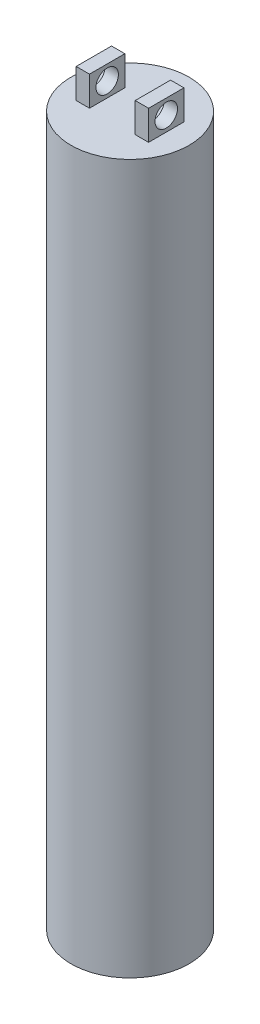
ISO-10303-21;
HEADER;
FILE_DESCRIPTION(('STEP AP214'),'2;1');
FILE_NAME('part.step','',(''),(''),'','','');
FILE_SCHEMA(('AUTOMOTIVE_DESIGN { 1 0 10303 214 1 1 1 1 }'));
ENDSEC;
DATA;
#1=APPLICATION_CONTEXT('core data for automotive mechanical design processes');
#2=APPLICATION_PROTOCOL_DEFINITION('international standard','automotive_design',2000,#1);
#3=PRODUCT_CONTEXT('',#1,'mechanical');
#4=PRODUCT('Part','Part','',(#3));
#5=PRODUCT_RELATED_PRODUCT_CATEGORY('part','',(#4));
#6=PRODUCT_DEFINITION_FORMATION('','',#4);
#7=PRODUCT_DEFINITION_CONTEXT('part definition',#1,'design');
#8=PRODUCT_DEFINITION('design','',#6,#7);
#9=PRODUCT_DEFINITION_SHAPE('','',#8);
#10=(LENGTH_UNIT() NAMED_UNIT(*) SI_UNIT(.MILLI.,.METRE.));
#11=(NAMED_UNIT(*) PLANE_ANGLE_UNIT() SI_UNIT($,.RADIAN.));
#12=(NAMED_UNIT(*) SI_UNIT($,.STERADIAN.) SOLID_ANGLE_UNIT());
#13=UNCERTAINTY_MEASURE_WITH_UNIT(LENGTH_MEASURE(1.E-05),#10,'distance_accuracy_value','');
#14=(GEOMETRIC_REPRESENTATION_CONTEXT(3) GLOBAL_UNCERTAINTY_ASSIGNED_CONTEXT((#13)) GLOBAL_UNIT_ASSIGNED_CONTEXT((#10,
#11,#12)) REPRESENTATION_CONTEXT('',''));
#15=CARTESIAN_POINT('',(0.,0.,0.));
#16=DIRECTION('',(0.,0.,1.));
#17=DIRECTION('',(1.,0.,0.));
#18=AXIS2_PLACEMENT_3D('',#15,#16,#17);
#19=CARTESIAN_POINT('',(0.,304.8,0.));
#20=DIRECTION('',(0.,1.,0.));
#21=DIRECTION('',(0.,0.,1.));
#22=AXIS2_PLACEMENT_3D('',#19,#20,#21);
#23=PLANE('',#22);
#24=CARTESIAN_POINT('',(0.,304.8,0.));
#25=DIRECTION('',(0.,1.,0.));
#26=DIRECTION('',(0.,0.,1.));
#27=AXIS2_PLACEMENT_3D('',#24,#25,#26);
#28=CIRCLE('',#27,25.4);
#29=CARTESIAN_POINT('',(0.,304.8,-25.4));
#30=VERTEX_POINT('',#29);
#31=EDGE_CURVE('E13',#30,#30,#28,.T.);
#32=ORIENTED_EDGE('',*,*,#31,.T.);
#33=EDGE_LOOP('',(#32));
#34=FACE_BOUND('',#33,.T.);
#35=DIRECTION('',(0.,0.,-1.));
#36=VECTOR('',#35,1.);
#37=CARTESIAN_POINT('',(15.5768216440334,304.8,0.));
#38=LINE('',#37,#36);
#39=CARTESIAN_POINT('',(15.5768216440334,304.8,7.60671258799468));
#40=VERTEX_POINT('',#39);
#41=CARTESIAN_POINT('',(15.5768216440334,304.8,-7.60671258799468));
#42=VERTEX_POINT('',#41);
#43=EDGE_CURVE('E147',#40,#42,#38,.T.);
#44=ORIENTED_EDGE('',*,*,#43,.F.);
#45=DIRECTION('',(1.,0.,0.));
#46=VECTOR('',#45,1.);
#47=CARTESIAN_POINT('',(0.,304.8,7.60671258799468));
#48=LINE('',#47,#46);
#49=CARTESIAN_POINT('',(9.82317835596661,304.8,7.60671258799468));
#50=VERTEX_POINT('',#49);
#51=EDGE_CURVE('E144',#50,#40,#48,.T.);
#52=ORIENTED_EDGE('',*,*,#51,.F.);
#53=DIRECTION('',(0.,0.,-1.));
#54=VECTOR('',#53,1.);
#55=CARTESIAN_POINT('',(9.82317835596661,304.8,0.));
#56=LINE('',#55,#54);
#57=CARTESIAN_POINT('',(9.82317835596661,304.8,-7.60671258799468));
#58=VERTEX_POINT('',#57);
#59=EDGE_CURVE('E157',#50,#58,#56,.T.);
#60=ORIENTED_EDGE('',*,*,#59,.T.);
#61=DIRECTION('',(1.,0.,0.));
#62=VECTOR('',#61,1.);
#63=CARTESIAN_POINT('',(0.,304.8,-7.60671258799468));
#64=LINE('',#63,#62);
#65=EDGE_CURVE('E168',#58,#42,#64,.T.);
#66=ORIENTED_EDGE('',*,*,#65,.T.);
#67=EDGE_LOOP('',(#44,#52,#60,#66));
#68=FACE_BOUND('',#67,.T.);
#69=DIRECTION('',(0.,0.,-1.));
#70=VECTOR('',#69,1.);
#71=CARTESIAN_POINT('',(-9.83341254623338,304.8,0.));
#72=LINE('',#71,#70);
#73=CARTESIAN_POINT('',(-9.83341254623338,304.8,7.60671258799468));
#74=VERTEX_POINT('',#73);
#75=CARTESIAN_POINT('',(-9.83341254623338,304.8,-7.60671258799468));
#76=VERTEX_POINT('',#75);
#77=EDGE_CURVE('E72',#74,#76,#72,.T.);
#78=ORIENTED_EDGE('',*,*,#77,.F.);
#79=DIRECTION('',(1.,0.,0.));
#80=VECTOR('',#79,1.);
#81=CARTESIAN_POINT('',(0.,304.8,7.60671258799468));
#82=LINE('',#81,#80);
#83=CARTESIAN_POINT('',(-15.5665874537666,304.8,7.60671258799468));
#84=VERTEX_POINT('',#83);
#85=EDGE_CURVE('E143',#84,#74,#82,.T.);
#86=ORIENTED_EDGE('',*,*,#85,.F.);
#87=DIRECTION('',(0.,0.,-1.));
#88=VECTOR('',#87,1.);
#89=CARTESIAN_POINT('',(-15.5665874537666,304.8,0.));
#90=LINE('',#89,#88);
#91=CARTESIAN_POINT('',(-15.5665874537666,304.8,-7.60671258799468));
#92=VERTEX_POINT('',#91);
#93=EDGE_CURVE('E140',#84,#92,#90,.T.);
#94=ORIENTED_EDGE('',*,*,#93,.T.);
#95=DIRECTION('',(1.,0.,0.));
#96=VECTOR('',#95,1.);
#97=CARTESIAN_POINT('',(0.,304.8,-7.60671258799468));
#98=LINE('',#97,#96);
#99=EDGE_CURVE('E77',#92,#76,#98,.T.);
#100=ORIENTED_EDGE('',*,*,#99,.T.);
#101=EDGE_LOOP('',(#78,#86,#94,#100));
#102=FACE_BOUND('',#101,.T.);
#103=ADVANCED_FACE('F55',(#34,#68,#102),#23,.T.);
#104=CARTESIAN_POINT('',(0.,304.8,0.));
#105=DIRECTION('',(0.,-1.,0.));
#106=DIRECTION('',(0.,0.,-1.));
#107=AXIS2_PLACEMENT_3D('',#104,#105,#106);
#108=CYLINDRICAL_SURFACE('',#107,25.4);
#109=CARTESIAN_POINT('',(0.,0.,0.));
#110=DIRECTION('',(0.,1.,0.));
#111=DIRECTION('',(0.,0.,1.));
#112=AXIS2_PLACEMENT_3D('',#109,#110,#111);
#113=CIRCLE('',#112,25.4);
#114=CARTESIAN_POINT('',(0.,0.,-25.4));
#115=VERTEX_POINT('',#114);
#116=EDGE_CURVE('E64',#115,#115,#113,.T.);
#117=CARTESIAN_POINT('',(0.,304.8,-25.4));
#118=CARTESIAN_POINT('',(0.,301.625,-25.4));
#119=CARTESIAN_POINT('',(0.,298.45,-25.4));
#120=CARTESIAN_POINT('',(0.,292.1,-25.4));
#121=CARTESIAN_POINT('',(0.,288.925,-25.4));
#122=CARTESIAN_POINT('',(0.,282.575,-25.4));
#123=CARTESIAN_POINT('',(0.,279.4,-25.4));
#124=CARTESIAN_POINT('',(0.,273.05,-25.4));
#125=CARTESIAN_POINT('',(0.,269.875,-25.4));
#126=CARTESIAN_POINT('',(0.,263.525,-25.4));
#127=CARTESIAN_POINT('',(0.,260.35,-25.4));
#128=CARTESIAN_POINT('',(0.,254.,-25.4));
#129=CARTESIAN_POINT('',(0.,250.825,-25.4));
#130=CARTESIAN_POINT('',(0.,244.475,-25.4));
#131=CARTESIAN_POINT('',(0.,241.3,-25.4));
#132=CARTESIAN_POINT('',(0.,234.95,-25.4));
#133=CARTESIAN_POINT('',(0.,231.775,-25.4));
#134=CARTESIAN_POINT('',(0.,225.425,-25.4));
#135=CARTESIAN_POINT('',(0.,222.25,-25.4));
#136=CARTESIAN_POINT('',(0.,215.9,-25.4));
#137=CARTESIAN_POINT('',(0.,212.725,-25.4));
#138=CARTESIAN_POINT('',(0.,206.375,-25.4));
#139=CARTESIAN_POINT('',(0.,203.2,-25.4));
#140=CARTESIAN_POINT('',(0.,196.85,-25.4));
#141=CARTESIAN_POINT('',(0.,193.675,-25.4));
#142=CARTESIAN_POINT('',(0.,187.325,-25.4));
#143=CARTESIAN_POINT('',(0.,184.15,-25.4));
#144=CARTESIAN_POINT('',(0.,177.8,-25.4));
#145=CARTESIAN_POINT('',(0.,174.625,-25.4));
#146=CARTESIAN_POINT('',(0.,168.275,-25.4));
#147=CARTESIAN_POINT('',(0.,165.1,-25.4));
#148=CARTESIAN_POINT('',(0.,158.75,-25.4));
#149=CARTESIAN_POINT('',(0.,155.575,-25.4));
#150=CARTESIAN_POINT('',(0.,149.225,-25.4));
#151=CARTESIAN_POINT('',(0.,146.05,-25.4));
#152=CARTESIAN_POINT('',(0.,139.7,-25.4));
#153=CARTESIAN_POINT('',(0.,136.525,-25.4));
#154=CARTESIAN_POINT('',(0.,130.175,-25.4));
#155=CARTESIAN_POINT('',(0.,127.,-25.4));
#156=CARTESIAN_POINT('',(0.,120.65,-25.4));
#157=CARTESIAN_POINT('',(0.,117.475,-25.4));
#158=CARTESIAN_POINT('',(0.,111.125,-25.4));
#159=CARTESIAN_POINT('',(0.,107.95,-25.4));
#160=CARTESIAN_POINT('',(0.,101.6,-25.4));
#161=CARTESIAN_POINT('',(0.,98.425,-25.4));
#162=CARTESIAN_POINT('',(0.,92.075,-25.4));
#163=CARTESIAN_POINT('',(0.,88.9,-25.4));
#164=CARTESIAN_POINT('',(0.,82.55,-25.4));
#165=CARTESIAN_POINT('',(0.,79.375,-25.4));
#166=CARTESIAN_POINT('',(0.,73.025,-25.4));
#167=CARTESIAN_POINT('',(0.,69.85,-25.4));
#168=CARTESIAN_POINT('',(0.,63.5,-25.4));
#169=CARTESIAN_POINT('',(0.,60.325,-25.4));
#170=CARTESIAN_POINT('',(0.,53.975,-25.4));
#171=CARTESIAN_POINT('',(0.,50.8,-25.4));
#172=CARTESIAN_POINT('',(0.,44.45,-25.4));
#173=CARTESIAN_POINT('',(0.,41.275,-25.4));
#174=CARTESIAN_POINT('',(0.,34.925,-25.4));
#175=CARTESIAN_POINT('',(0.,31.75,-25.4));
#176=CARTESIAN_POINT('',(0.,25.4,-25.4));
#177=CARTESIAN_POINT('',(0.,22.225,-25.4));
#178=CARTESIAN_POINT('',(0.,15.875,-25.4));
#179=CARTESIAN_POINT('',(0.,12.7,-25.4));
#180=CARTESIAN_POINT('',(0.,6.35,-25.4));
#181=CARTESIAN_POINT('',(0.,3.175,-25.4));
#182=CARTESIAN_POINT('',(0.,0.,-25.4));
#183=B_SPLINE_CURVE_WITH_KNOTS('',3,(#117,#118,#119,#120,#121,#122,#123,#124,#125,#126,#127,
#128,#129,#130,#131,#132,#133,#134,#135,#136,#137,#138,#139,#140,#141,#142,#143,#144,#145,#146,
#147,#148,#149,#150,#151,#152,#153,#154,#155,#156,#157,#158,#159,#160,#161,#162,#163,#164,#165,
#166,#167,#168,#169,#170,#171,#172,#173,#174,#175,#176,#177,#178,#179,#180,#181,#182),
.UNSPECIFIED.,.F.,.F.,(4,2,2,2,2,2,2,2,2,2,2,2,2,2,2,2,2,2,2,2,2,2,2,2,2,2,2,2,2,2,2,2,4),(0.,
9.52499999999995,19.05,28.575,38.1,47.625,57.15,66.675,76.2,85.725,95.2499999999999,104.775,
114.3,123.825,133.35,142.875,152.4,161.925,171.45,180.975,190.5,200.025,209.55,219.075,228.6,
238.125,247.65,257.175,266.7,276.225,285.75,295.275,304.8),.UNSPECIFIED.);
#184=EDGE_CURVE('BSEAM57',#30,#115,#183,.T.);
#185=ORIENTED_EDGE('',*,*,#31,.F.);
#186=ORIENTED_EDGE('',*,*,#116,.T.);
#187=ORIENTED_EDGE('',*,*,#184,.T.);
#188=ORIENTED_EDGE('',*,*,#184,.F.);
#189=EDGE_LOOP('',(#185,#187,#186,#188));
#190=FACE_BOUND('',#189,.T.);
#191=ADVANCED_FACE('F57',(#190),#108,.T.);
#192=CARTESIAN_POINT('',(0.,0.,0.));
#193=DIRECTION('',(0.,1.,0.));
#194=DIRECTION('',(0.,0.,1.));
#195=AXIS2_PLACEMENT_3D('',#192,#193,#194);
#196=PLANE('',#195);
#197=CARTESIAN_POINT('',(-12.7,0.,0.));
#198=DIRECTION('',(0.,-1.,0.));
#199=DIRECTION('',(0.,0.,-1.));
#200=AXIS2_PLACEMENT_3D('',#197,#198,#199);
#201=CIRCLE('',#200,4.7625);
#202=CARTESIAN_POINT('',(-12.7,0.,-4.7625));
#203=VERTEX_POINT('',#202);
#204=EDGE_CURVE('E262',#203,#203,#201,.T.);
#205=ORIENTED_EDGE('',*,*,#204,.F.);
#206=EDGE_LOOP('',(#205));
#207=FACE_BOUND('',#206,.T.);
#208=CARTESIAN_POINT('',(12.7,0.,0.));
#209=DIRECTION('',(0.,-1.,0.));
#210=DIRECTION('',(0.,0.,-1.));
#211=AXIS2_PLACEMENT_3D('',#208,#209,#210);
#212=CIRCLE('',#211,4.7625);
#213=CARTESIAN_POINT('',(12.7,0.,-4.7625));
#214=VERTEX_POINT('',#213);
#215=EDGE_CURVE('E267',#214,#214,#212,.T.);
#216=ORIENTED_EDGE('',*,*,#215,.F.);
#217=EDGE_LOOP('',(#216));
#218=FACE_BOUND('',#217,.T.);
#219=ORIENTED_EDGE('',*,*,#116,.F.);
#220=EDGE_LOOP('',(#219));
#221=FACE_BOUND('',#220,.T.);
#222=ADVANCED_FACE('F185',(#207,#218,#221),#196,.F.);
#223=CARTESIAN_POINT('',(0.,317.5,7.60671258799468));
#224=DIRECTION('',(0.,0.,-1.));
#225=DIRECTION('',(-1.,0.,0.));
#226=AXIS2_PLACEMENT_3D('',#223,#224,#225);
#227=PLANE('',#226);
#228=ORIENTED_EDGE('',*,*,#51,.T.);
#229=DIRECTION('',(0.,-1.,0.));
#230=VECTOR('',#229,1.);
#231=CARTESIAN_POINT('',(15.5768216440334,317.5,7.60671258799468));
#232=LINE('',#231,#230);
#233=CARTESIAN_POINT('',(15.5768216440334,317.5,7.60671258799468));
#234=VERTEX_POINT('',#233);
#235=EDGE_CURVE('E179',#234,#40,#232,.T.);
#236=ORIENTED_EDGE('',*,*,#235,.F.);
#237=DIRECTION('',(1.,0.,0.));
#238=VECTOR('',#237,1.);
#239=CARTESIAN_POINT('',(0.,317.5,7.60671258799468));
#240=LINE('',#239,#238);
#241=CARTESIAN_POINT('',(9.82317835596661,317.5,7.60671258799468));
#242=VERTEX_POINT('',#241);
#243=EDGE_CURVE('E153',#242,#234,#240,.T.);
#244=ORIENTED_EDGE('',*,*,#243,.F.);
#245=DIRECTION('',(0.,-1.,0.));
#246=VECTOR('',#245,1.);
#247=CARTESIAN_POINT('',(9.82317835596661,317.5,7.60671258799468));
#248=LINE('',#247,#246);
#249=EDGE_CURVE('E164',#242,#50,#248,.T.);
#250=ORIENTED_EDGE('',*,*,#249,.T.);
#251=EDGE_LOOP('',(#228,#236,#244,#250));
#252=FACE_BOUND('',#251,.T.);
#253=ADVANCED_FACE('F187',(#252),#227,.F.);
#254=CARTESIAN_POINT('',(15.5768216440334,317.5,0.));
#255=DIRECTION('',(-1.,0.,0.));
#256=DIRECTION('',(0.,0.,1.));
#257=AXIS2_PLACEMENT_3D('',#254,#255,#256);
#258=PLANE('',#257);
#259=CARTESIAN_POINT('',(15.5768216440334,311.15,0.));
#260=DIRECTION('',(1.,0.,0.));
#261=DIRECTION('',(0.,0.,-1.));
#262=AXIS2_PLACEMENT_3D('',#259,#260,#261);
#263=CIRCLE('',#262,4.82600000000001);
#264=CARTESIAN_POINT('',(15.5768216440334,311.15,-4.82600000000001));
#265=VERTEX_POINT('',#264);
#266=EDGE_CURVE('E261',#265,#265,#263,.T.);
#267=ORIENTED_EDGE('',*,*,#266,.F.);
#268=EDGE_LOOP('',(#267));
#269=FACE_BOUND('',#268,.T.);
#270=ORIENTED_EDGE('',*,*,#43,.T.);
#271=DIRECTION('',(0.,-1.,0.));
#272=VECTOR('',#271,1.);
#273=CARTESIAN_POINT('',(15.5768216440334,317.5,-7.60671258799468));
#274=LINE('',#273,#272);
#275=CARTESIAN_POINT('',(15.5768216440334,317.5,-7.60671258799468));
#276=VERTEX_POINT('',#275);
#277=EDGE_CURVE('E176',#276,#42,#274,.T.);
#278=ORIENTED_EDGE('',*,*,#277,.F.);
#279=DIRECTION('',(0.,0.,-1.));
#280=VECTOR('',#279,1.);
#281=CARTESIAN_POINT('',(15.5768216440334,317.5,0.));
#282=LINE('',#281,#280);
#283=EDGE_CURVE('E156',#234,#276,#282,.T.);
#284=ORIENTED_EDGE('',*,*,#283,.F.);
#285=ORIENTED_EDGE('',*,*,#235,.T.);
#286=EDGE_LOOP('',(#270,#278,#284,#285));
#287=FACE_BOUND('',#286,.T.);
#288=ADVANCED_FACE('F193',(#269,#287),#258,.F.);
#289=CARTESIAN_POINT('',(0.,317.5,-7.60671258799468));
#290=DIRECTION('',(0.,0.,-1.));
#291=DIRECTION('',(-1.,0.,0.));
#292=AXIS2_PLACEMENT_3D('',#289,#290,#291);
#293=PLANE('',#292);
#294=ORIENTED_EDGE('',*,*,#65,.F.);
#295=DIRECTION('',(0.,-1.,0.));
#296=VECTOR('',#295,1.);
#297=CARTESIAN_POINT('',(9.82317835596661,317.5,-7.60671258799468));
#298=LINE('',#297,#296);
#299=CARTESIAN_POINT('',(9.82317835596661,317.5,-7.60671258799468));
#300=VERTEX_POINT('',#299);
#301=EDGE_CURVE('E173',#300,#58,#298,.T.);
#302=ORIENTED_EDGE('',*,*,#301,.F.);
#303=DIRECTION('',(1.,0.,0.));
#304=VECTOR('',#303,1.);
#305=CARTESIAN_POINT('',(0.,317.5,-7.60671258799468));
#306=LINE('',#305,#304);
#307=EDGE_CURVE('E159',#300,#276,#306,.T.);
#308=ORIENTED_EDGE('',*,*,#307,.T.);
#309=ORIENTED_EDGE('',*,*,#277,.T.);
#310=EDGE_LOOP('',(#294,#302,#308,#309));
#311=FACE_BOUND('',#310,.T.);
#312=ADVANCED_FACE('F208',(#311),#293,.T.);
#313=CARTESIAN_POINT('',(9.82317835596661,317.5,0.));
#314=DIRECTION('',(-1.,0.,0.));
#315=DIRECTION('',(0.,0.,1.));
#316=AXIS2_PLACEMENT_3D('',#313,#314,#315);
#317=PLANE('',#316);
#318=CARTESIAN_POINT('',(9.82317835596661,311.15,0.));
#319=DIRECTION('',(-1.,0.,0.));
#320=DIRECTION('',(0.,0.,1.));
#321=AXIS2_PLACEMENT_3D('',#318,#319,#320);
#322=CIRCLE('',#321,4.82600000000001);
#323=CARTESIAN_POINT('',(9.82317835596661,311.15,4.82600000000001));
#324=VERTEX_POINT('',#323);
#325=EDGE_CURVE('E278',#324,#324,#322,.T.);
#326=ORIENTED_EDGE('',*,*,#325,.F.);
#327=EDGE_LOOP('',(#326));
#328=FACE_BOUND('',#327,.T.);
#329=ORIENTED_EDGE('',*,*,#59,.F.);
#330=ORIENTED_EDGE('',*,*,#249,.F.);
#331=DIRECTION('',(0.,0.,-1.));
#332=VECTOR('',#331,1.);
#333=CARTESIAN_POINT('',(9.82317835596661,317.5,0.));
#334=LINE('',#333,#332);
#335=EDGE_CURVE('E162',#242,#300,#334,.T.);
#336=ORIENTED_EDGE('',*,*,#335,.T.);
#337=ORIENTED_EDGE('',*,*,#301,.T.);
#338=EDGE_LOOP('',(#329,#330,#336,#337));
#339=FACE_BOUND('',#338,.T.);
#340=ADVANCED_FACE('F212',(#328,#339),#317,.T.);
#341=CARTESIAN_POINT('',(0.,317.5,0.));
#342=DIRECTION('',(0.,1.,0.));
#343=DIRECTION('',(0.,0.,1.));
#344=AXIS2_PLACEMENT_3D('',#341,#342,#343);
#345=PLANE('',#344);
#346=ORIENTED_EDGE('',*,*,#243,.T.);
#347=ORIENTED_EDGE('',*,*,#283,.T.);
#348=ORIENTED_EDGE('',*,*,#307,.F.);
#349=ORIENTED_EDGE('',*,*,#335,.F.);
#350=EDGE_LOOP('',(#346,#347,#348,#349));
#351=FACE_BOUND('',#350,.T.);
#352=ADVANCED_FACE('F216',(#351),#345,.T.);
#353=CARTESIAN_POINT('',(0.,317.5,7.60671258799468));
#354=DIRECTION('',(0.,0.,-1.));
#355=DIRECTION('',(-1.,0.,0.));
#356=AXIS2_PLACEMENT_3D('',#353,#354,#355);
#357=PLANE('',#356);
#358=ORIENTED_EDGE('',*,*,#85,.T.);
#359=DIRECTION('',(0.,-1.,0.));
#360=VECTOR('',#359,1.);
#361=CARTESIAN_POINT('',(-9.83341254623338,317.5,7.60671258799468));
#362=LINE('',#361,#360);
#363=CARTESIAN_POINT('',(-9.83341254623338,317.5,7.60671258799468));
#364=VERTEX_POINT('',#363);
#365=EDGE_CURVE('E124',#364,#74,#362,.T.);
#366=ORIENTED_EDGE('',*,*,#365,.F.);
#367=DIRECTION('',(1.,0.,0.));
#368=VECTOR('',#367,1.);
#369=CARTESIAN_POINT('',(0.,317.5,7.60671258799468));
#370=LINE('',#369,#368);
#371=CARTESIAN_POINT('',(-15.5665874537666,317.5,7.60671258799468));
#372=VERTEX_POINT('',#371);
#373=EDGE_CURVE('E131',#372,#364,#370,.T.);
#374=ORIENTED_EDGE('',*,*,#373,.F.);
#375=DIRECTION('',(0.,-1.,0.));
#376=VECTOR('',#375,1.);
#377=CARTESIAN_POINT('',(-15.5665874537666,317.5,7.60671258799468));
#378=LINE('',#377,#376);
#379=EDGE_CURVE('E283',#372,#84,#378,.T.);
#380=ORIENTED_EDGE('',*,*,#379,.T.);
#381=EDGE_LOOP('',(#358,#366,#374,#380));
#382=FACE_BOUND('',#381,.T.);
#383=ADVANCED_FACE('F142',(#382),#357,.F.);
#384=CARTESIAN_POINT('',(-9.83341254623338,317.5,0.));
#385=DIRECTION('',(-1.,0.,0.));
#386=DIRECTION('',(0.,0.,1.));
#387=AXIS2_PLACEMENT_3D('',#384,#385,#386);
#388=PLANE('',#387);
#389=CARTESIAN_POINT('',(-9.83341254623338,311.15,0.));
#390=DIRECTION('',(-1.,0.,0.));
#391=DIRECTION('',(0.,0.,1.));
#392=AXIS2_PLACEMENT_3D('',#389,#390,#391);
#393=CIRCLE('',#392,4.82600000000001);
#394=CARTESIAN_POINT('',(-9.83341254623338,311.15,4.82600000000001));
#395=VERTEX_POINT('',#394);
#396=EDGE_CURVE('E275',#395,#395,#393,.T.);
#397=ORIENTED_EDGE('',*,*,#396,.T.);
#398=EDGE_LOOP('',(#397));
#399=FACE_BOUND('',#398,.T.);
#400=ORIENTED_EDGE('',*,*,#77,.T.);
#401=DIRECTION('',(0.,-1.,0.));
#402=VECTOR('',#401,1.);
#403=CARTESIAN_POINT('',(-9.83341254623338,317.5,-7.60671258799468));
#404=LINE('',#403,#402);
#405=CARTESIAN_POINT('',(-9.83341254623338,317.5,-7.60671258799468));
#406=VERTEX_POINT('',#405);
#407=EDGE_CURVE('E126',#406,#76,#404,.T.);
#408=ORIENTED_EDGE('',*,*,#407,.F.);
#409=DIRECTION('',(0.,0.,-1.));
#410=VECTOR('',#409,1.);
#411=CARTESIAN_POINT('',(-9.83341254623338,317.5,0.));
#412=LINE('',#411,#410);
#413=EDGE_CURVE('E120',#364,#406,#412,.T.);
#414=ORIENTED_EDGE('',*,*,#413,.F.);
#415=ORIENTED_EDGE('',*,*,#365,.T.);
#416=EDGE_LOOP('',(#400,#408,#414,#415));
#417=FACE_BOUND('',#416,.T.);
#418=ADVANCED_FACE('F122',(#399,#417),#388,.F.);
#419=CARTESIAN_POINT('',(0.,317.5,-7.60671258799468));
#420=DIRECTION('',(0.,0.,-1.));
#421=DIRECTION('',(-1.,0.,0.));
#422=AXIS2_PLACEMENT_3D('',#419,#420,#421);
#423=PLANE('',#422);
#424=ORIENTED_EDGE('',*,*,#99,.F.);
#425=DIRECTION('',(0.,-1.,0.));
#426=VECTOR('',#425,1.);
#427=CARTESIAN_POINT('',(-15.5665874537666,317.5,-7.60671258799468));
#428=LINE('',#427,#426);
#429=CARTESIAN_POINT('',(-15.5665874537666,317.5,-7.60671258799468));
#430=VERTEX_POINT('',#429);
#431=EDGE_CURVE('E149',#430,#92,#428,.T.);
#432=ORIENTED_EDGE('',*,*,#431,.F.);
#433=DIRECTION('',(1.,0.,0.));
#434=VECTOR('',#433,1.);
#435=CARTESIAN_POINT('',(0.,317.5,-7.60671258799468));
#436=LINE('',#435,#434);
#437=EDGE_CURVE('E130',#430,#406,#436,.T.);
#438=ORIENTED_EDGE('',*,*,#437,.T.);
#439=ORIENTED_EDGE('',*,*,#407,.T.);
#440=EDGE_LOOP('',(#424,#432,#438,#439));
#441=FACE_BOUND('',#440,.T.);
#442=ADVANCED_FACE('F225',(#441),#423,.T.);
#443=CARTESIAN_POINT('',(-15.5665874537666,317.5,0.));
#444=DIRECTION('',(-1.,0.,0.));
#445=DIRECTION('',(0.,0.,1.));
#446=AXIS2_PLACEMENT_3D('',#443,#444,#445);
#447=PLANE('',#446);
#448=CARTESIAN_POINT('',(-15.5665874537666,311.15,0.));
#449=DIRECTION('',(-1.,0.,0.));
#450=DIRECTION('',(0.,0.,1.));
#451=AXIS2_PLACEMENT_3D('',#448,#449,#450);
#452=CIRCLE('',#451,4.82600000000001);
#453=CARTESIAN_POINT('',(-15.5665874537666,311.15,4.82600000000001));
#454=VERTEX_POINT('',#453);
#455=EDGE_CURVE('E59',#454,#454,#452,.T.);
#456=ORIENTED_EDGE('',*,*,#455,.F.);
#457=EDGE_LOOP('',(#456));
#458=FACE_BOUND('',#457,.T.);
#459=ORIENTED_EDGE('',*,*,#93,.F.);
#460=ORIENTED_EDGE('',*,*,#379,.F.);
#461=DIRECTION('',(0.,0.,-1.));
#462=VECTOR('',#461,1.);
#463=CARTESIAN_POINT('',(-15.5665874537666,317.5,0.));
#464=LINE('',#463,#462);
#465=EDGE_CURVE('E137',#372,#430,#464,.T.);
#466=ORIENTED_EDGE('',*,*,#465,.T.);
#467=ORIENTED_EDGE('',*,*,#431,.T.);
#468=EDGE_LOOP('',(#459,#460,#466,#467));
#469=FACE_BOUND('',#468,.T.);
#470=ADVANCED_FACE('F229',(#458,#469),#447,.T.);
#471=CARTESIAN_POINT('',(0.,317.5,0.));
#472=DIRECTION('',(0.,1.,0.));
#473=DIRECTION('',(0.,0.,1.));
#474=AXIS2_PLACEMENT_3D('',#471,#472,#473);
#475=PLANE('',#474);
#476=ORIENTED_EDGE('',*,*,#373,.T.);
#477=ORIENTED_EDGE('',*,*,#413,.T.);
#478=ORIENTED_EDGE('',*,*,#437,.F.);
#479=ORIENTED_EDGE('',*,*,#465,.F.);
#480=EDGE_LOOP('',(#476,#477,#478,#479));
#481=FACE_BOUND('',#480,.T.);
#482=ADVANCED_FACE('F135',(#481),#475,.T.);
#483=CARTESIAN_POINT('',(-47.1611783559666,311.15,0.));
#484=DIRECTION('',(1.,0.,0.));
#485=DIRECTION('',(0.,0.,-1.));
#486=AXIS2_PLACEMENT_3D('',#483,#484,#485);
#487=CYLINDRICAL_SURFACE('',#486,4.82600000000001);
#488=ORIENTED_EDGE('',*,*,#455,.T.);
#489=EDGE_LOOP('',(#488));
#490=FACE_BOUND('',#489,.T.);
#491=ORIENTED_EDGE('',*,*,#396,.F.);
#492=EDGE_LOOP('',(#491));
#493=FACE_BOUND('',#492,.T.);
#494=ADVANCED_FACE('F236',(#490,#493),#487,.F.);
#495=ORIENTED_EDGE('',*,*,#325,.T.);
#496=EDGE_LOOP('',(#495));
#497=FACE_BOUND('',#496,.T.);
#498=ORIENTED_EDGE('',*,*,#266,.T.);
#499=EDGE_LOOP('',(#498));
#500=FACE_BOUND('',#499,.T.);
#501=ADVANCED_FACE('F237',(#497,#500),#487,.F.);
#502=CARTESIAN_POINT('',(12.7,2.54,0.));
#503=DIRECTION('',(0.,-1.,0.));
#504=DIRECTION('',(0.,0.,-1.));
#505=AXIS2_PLACEMENT_3D('',#502,#503,#504);
#506=CYLINDRICAL_SURFACE('',#505,4.7625);
#507=CARTESIAN_POINT('',(12.7,2.54,0.));
#508=DIRECTION('',(0.,-1.,0.));
#509=DIRECTION('',(0.,0.,-1.));
#510=AXIS2_PLACEMENT_3D('',#507,#508,#509);
#511=CIRCLE('',#510,4.7625);
#512=CARTESIAN_POINT('',(12.7,2.54,-4.7625));
#513=VERTEX_POINT('',#512);
#514=EDGE_CURVE('E272',#513,#513,#511,.T.);
#515=ORIENTED_EDGE('',*,*,#514,.F.);
#516=EDGE_LOOP('',(#515));
#517=FACE_BOUND('',#516,.T.);
#518=ORIENTED_EDGE('',*,*,#215,.T.);
#519=EDGE_LOOP('',(#518));
#520=FACE_BOUND('',#519,.T.);
#521=ADVANCED_FACE('F240',(#517,#520),#506,.F.);
#522=CARTESIAN_POINT('',(12.7,2.54,0.));
#523=DIRECTION('',(0.,-1.,0.));
#524=DIRECTION('',(0.,0.,-1.));
#525=AXIS2_PLACEMENT_3D('',#522,#523,#524);
#526=PLANE('',#525);
#527=ORIENTED_EDGE('',*,*,#514,.T.);
#528=EDGE_LOOP('',(#527));
#529=FACE_BOUND('',#528,.T.);
#530=ADVANCED_FACE('F242',(#529),#526,.T.);
#531=CARTESIAN_POINT('',(-12.7,2.54,0.));
#532=DIRECTION('',(0.,-1.,0.));
#533=DIRECTION('',(0.,0.,-1.));
#534=AXIS2_PLACEMENT_3D('',#531,#532,#533);
#535=CYLINDRICAL_SURFACE('',#534,4.7625);
#536=CARTESIAN_POINT('',(-12.7,2.54,0.));
#537=DIRECTION('',(0.,-1.,0.));
#538=DIRECTION('',(0.,0.,-1.));
#539=AXIS2_PLACEMENT_3D('',#536,#537,#538);
#540=CIRCLE('',#539,4.7625);
#541=CARTESIAN_POINT('',(-12.7,2.54,-4.7625));
#542=VERTEX_POINT('',#541);
#543=EDGE_CURVE('E260',#542,#542,#540,.T.);
#544=ORIENTED_EDGE('',*,*,#543,.F.);
#545=EDGE_LOOP('',(#544));
#546=FACE_BOUND('',#545,.T.);
#547=ORIENTED_EDGE('',*,*,#204,.T.);
#548=EDGE_LOOP('',(#547));
#549=FACE_BOUND('',#548,.T.);
#550=ADVANCED_FACE('F245',(#546,#549),#535,.F.);
#551=CARTESIAN_POINT('',(-12.7,2.54,0.));
#552=DIRECTION('',(0.,-1.,0.));
#553=DIRECTION('',(0.,0.,-1.));
#554=AXIS2_PLACEMENT_3D('',#551,#552,#553);
#555=PLANE('',#554);
#556=ORIENTED_EDGE('',*,*,#543,.T.);
#557=EDGE_LOOP('',(#556));
#558=FACE_BOUND('',#557,.T.);
#559=ADVANCED_FACE('F252',(#558),#555,.T.);
#560=CLOSED_SHELL('',(#103,#191,#222,#253,#288,#312,#340,#352,#383,#418,#442,#470,#482,#494,
#501,#521,#530,#550,#559));
#561=MANIFOLD_SOLID_BREP('B2',#560);
#562=ADVANCED_BREP_SHAPE_REPRESENTATION('',(#18,#561),#14);
#563=SHAPE_DEFINITION_REPRESENTATION(#9,#562);
ENDSEC;
END-ISO-10303-21;
